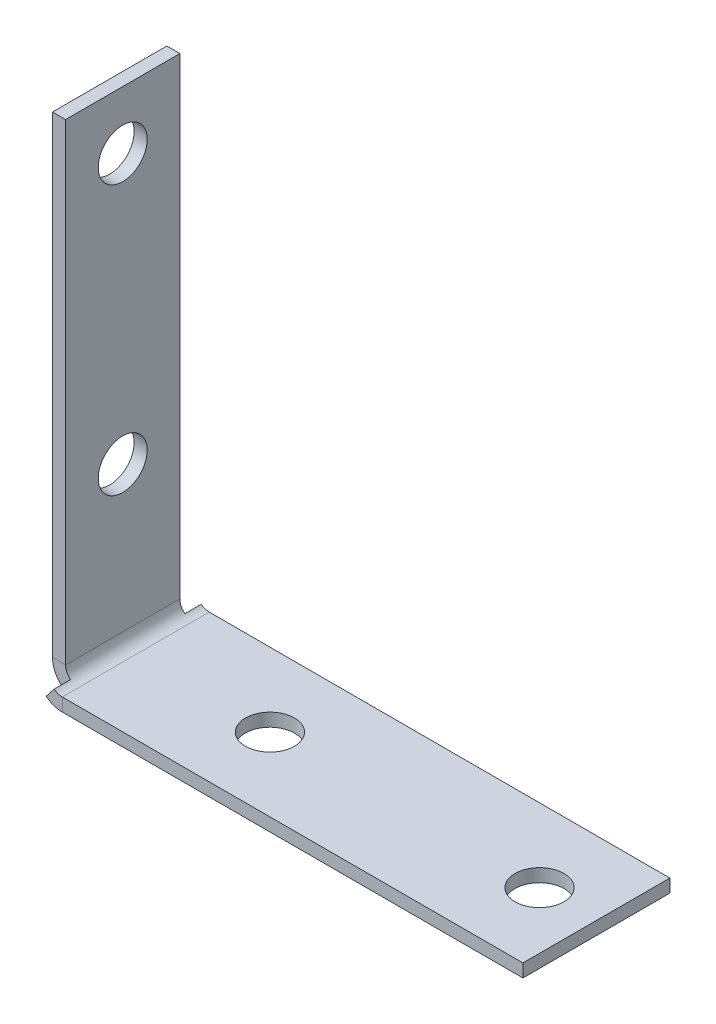
ISO-10303-21;
HEADER;
FILE_DESCRIPTION(('STEP AP214'),'2;1');
FILE_NAME('part.step','',(''),(''),'','','');
FILE_SCHEMA(('AUTOMOTIVE_DESIGN { 1 0 10303 214 1 1 1 1 }'));
ENDSEC;
DATA;
#1=APPLICATION_CONTEXT('core data for automotive mechanical design processes');
#2=APPLICATION_PROTOCOL_DEFINITION('international standard','automotive_design',2000,#1);
#3=PRODUCT_CONTEXT('',#1,'mechanical');
#4=PRODUCT('Part','Part','',(#3));
#5=PRODUCT_RELATED_PRODUCT_CATEGORY('part','',(#4));
#6=PRODUCT_DEFINITION_FORMATION('','',#4);
#7=PRODUCT_DEFINITION_CONTEXT('part definition',#1,'design');
#8=PRODUCT_DEFINITION('design','',#6,#7);
#9=PRODUCT_DEFINITION_SHAPE('','',#8);
#10=(LENGTH_UNIT() NAMED_UNIT(*) SI_UNIT(.MILLI.,.METRE.));
#11=(NAMED_UNIT(*) PLANE_ANGLE_UNIT() SI_UNIT($,.RADIAN.));
#12=(NAMED_UNIT(*) SI_UNIT($,.STERADIAN.) SOLID_ANGLE_UNIT());
#13=UNCERTAINTY_MEASURE_WITH_UNIT(LENGTH_MEASURE(1.E-05),#10,'distance_accuracy_value','');
#14=(GEOMETRIC_REPRESENTATION_CONTEXT(3) GLOBAL_UNCERTAINTY_ASSIGNED_CONTEXT((#13)) GLOBAL_UNIT_ASSIGNED_CONTEXT((#10,
#11,#12)) REPRESENTATION_CONTEXT('',''));
#15=CARTESIAN_POINT('',(0.,0.,0.));
#16=DIRECTION('',(0.,0.,1.));
#17=DIRECTION('',(1.,0.,0.));
#18=AXIS2_PLACEMENT_3D('',#15,#16,#17);
#19=CARTESIAN_POINT('',(-60.6697462830899,1.03008881569224,29.2051358956056));
#20=DIRECTION('',(0.,0.,1.));
#21=DIRECTION('',(0.,-1.,0.));
#22=AXIS2_PLACEMENT_3D('',#19,#20,#21);
#23=PLANE('',#22);
#24=DIRECTION('',(0.,-1.,0.));
#25=VECTOR('',#24,1.);
#26=CARTESIAN_POINT('',(-62.2697462830901,-59.6396574673976,29.2051358956056));
#27=LINE('',#26,#25);
#28=CARTESIAN_POINT('',(-62.2697462830896,61.0300888156922,29.2051358956056));
#29=VERTEX_POINT('',#28);
#30=CARTESIAN_POINT('',(-62.2697462830899,3.20000000000001,29.2051358956056));
#31=VERTEX_POINT('',#30);
#32=EDGE_CURVE('E175',#29,#31,#27,.T.);
#33=ORIENTED_EDGE('',*,*,#32,.T.);
#34=DIRECTION('',(1.,0.,0.));
#35=VECTOR('',#34,1.);
#36=CARTESIAN_POINT('',(-60.6697462830899,3.20000000000001,29.2051358956056));
#37=LINE('',#36,#35);
#38=CARTESIAN_POINT('',(-60.6697462830899,3.2,29.2051358956056));
#39=VERTEX_POINT('',#38);
#40=EDGE_CURVE('E157',#31,#39,#37,.T.);
#41=ORIENTED_EDGE('',*,*,#40,.T.);
#42=DIRECTION('',(0.,-1.,0.));
#43=VECTOR('',#42,1.);
#44=CARTESIAN_POINT('',(-60.6697462830899,1.03008881569224,29.2051358956056));
#45=LINE('',#44,#43);
#46=CARTESIAN_POINT('',(-60.6697462830896,61.0300888156922,29.2051358956056));
#47=VERTEX_POINT('',#46);
#48=EDGE_CURVE('E177',#47,#39,#45,.T.);
#49=ORIENTED_EDGE('',*,*,#48,.F.);
#50=DIRECTION('',(1.,0.,0.));
#51=VECTOR('',#50,1.);
#52=CARTESIAN_POINT('',(-60.6697462830896,61.0300888156922,29.2051358956056));
#53=LINE('',#52,#51);
#54=EDGE_CURVE('E70',#29,#47,#53,.T.);
#55=ORIENTED_EDGE('',*,*,#54,.F.);
#56=EDGE_LOOP('',(#33,#41,#49,#55));
#57=FACE_BOUND('',#56,.T.);
#58=ADVANCED_FACE('F44',(#57),#23,.T.);
#59=CARTESIAN_POINT('',(-60.6697462830899,1.03008881569224,15.2051358956056));
#60=DIRECTION('',(0.,0.,-1.));
#61=DIRECTION('',(0.,1.,0.));
#62=AXIS2_PLACEMENT_3D('',#59,#60,#61);
#63=PLANE('',#62);
#64=DIRECTION('',(0.,1.,0.));
#65=VECTOR('',#64,1.);
#66=CARTESIAN_POINT('',(-60.6697462830899,1.03008881569224,15.2051358956056));
#67=LINE('',#66,#65);
#68=CARTESIAN_POINT('',(-60.6697462830899,3.20000000000001,15.2051358956056));
#69=VERTEX_POINT('',#68);
#70=CARTESIAN_POINT('',(-60.6697462830896,61.0300888156922,15.2051358956056));
#71=VERTEX_POINT('',#70);
#72=EDGE_CURVE('E171',#69,#71,#67,.T.);
#73=ORIENTED_EDGE('',*,*,#72,.F.);
#74=DIRECTION('',(-1.,0.,0.));
#75=VECTOR('',#74,1.);
#76=CARTESIAN_POINT('',(-60.6697462830899,3.20000000000001,15.2051358956056));
#77=LINE('',#76,#75);
#78=CARTESIAN_POINT('',(-62.2697462830899,3.20000000000001,15.2051358956056));
#79=VERTEX_POINT('',#78);
#80=EDGE_CURVE('E12',#69,#79,#77,.T.);
#81=ORIENTED_EDGE('',*,*,#80,.T.);
#82=DIRECTION('',(0.,-1.,0.));
#83=VECTOR('',#82,1.);
#84=CARTESIAN_POINT('',(-62.2697462830901,-59.6396574673976,15.2051358956056));
#85=LINE('',#84,#83);
#86=CARTESIAN_POINT('',(-62.2697462830896,61.0300888156922,15.2051358956056));
#87=VERTEX_POINT('',#86);
#88=EDGE_CURVE('E83',#79,#87,#85,.F.);
#89=ORIENTED_EDGE('',*,*,#88,.T.);
#90=DIRECTION('',(1.,0.,0.));
#91=VECTOR('',#90,1.);
#92=CARTESIAN_POINT('',(-60.6697462830896,61.0300888156922,15.2051358956056));
#93=LINE('',#92,#91);
#94=EDGE_CURVE('E172',#87,#71,#93,.T.);
#95=ORIENTED_EDGE('',*,*,#94,.T.);
#96=EDGE_LOOP('',(#73,#81,#89,#95));
#97=FACE_BOUND('',#96,.T.);
#98=ADVANCED_FACE('F46',(#97),#63,.T.);
#99=CARTESIAN_POINT('',(-60.6697462830901,-59.6396574673976,0.));
#100=DIRECTION('',(1.,0.,0.));
#101=DIRECTION('',(0.,0.,1.));
#102=AXIS2_PLACEMENT_3D('',#99,#100,#101);
#103=PLANE('',#102);
#104=CARTESIAN_POINT('',(-60.6697462830897,53.9427274603514,22.2051358956056));
#105=DIRECTION('',(1.,0.,0.));
#106=DIRECTION('',(0.,0.,-1.));
#107=AXIS2_PLACEMENT_3D('',#104,#105,#106);
#108=CIRCLE('',#107,3.);
#109=CARTESIAN_POINT('',(-60.6697462830897,53.9427274603514,19.2051358956056));
#110=VERTEX_POINT('',#109);
#111=EDGE_CURVE('E594',#110,#110,#108,.T.);
#112=ORIENTED_EDGE('',*,*,#111,.F.);
#113=EDGE_LOOP('',(#112));
#114=FACE_BOUND('',#113,.T.);
#115=CARTESIAN_POINT('',(-60.6697462830898,20.9806033722713,22.2051358956056));
#116=DIRECTION('',(1.,0.,0.));
#117=DIRECTION('',(0.,0.,-1.));
#118=AXIS2_PLACEMENT_3D('',#115,#116,#117);
#119=CIRCLE('',#118,2.99999999999999);
#120=CARTESIAN_POINT('',(-60.6697462830898,20.9806033722713,19.2051358956056));
#121=VERTEX_POINT('',#120);
#122=EDGE_CURVE('E589',#121,#121,#119,.T.);
#123=ORIENTED_EDGE('',*,*,#122,.F.);
#124=EDGE_LOOP('',(#123));
#125=FACE_BOUND('',#124,.T.);
#126=ORIENTED_EDGE('',*,*,#48,.T.);
#127=DIRECTION('',(0.,0.,-1.));
#128=VECTOR('',#127,1.);
#129=CARTESIAN_POINT('',(-60.6697462830899,3.20000000000001,0.));
#130=LINE('',#129,#128);
#131=EDGE_CURVE('E185',#39,#69,#130,.T.);
#132=ORIENTED_EDGE('',*,*,#131,.T.);
#133=ORIENTED_EDGE('',*,*,#72,.T.);
#134=DIRECTION('',(0.,0.,1.));
#135=VECTOR('',#134,1.);
#136=CARTESIAN_POINT('',(-60.6697462830896,61.0300888156922,15.2051358956056));
#137=LINE('',#136,#135);
#138=EDGE_CURVE('E174',#71,#47,#137,.T.);
#139=ORIENTED_EDGE('',*,*,#138,.T.);
#140=EDGE_LOOP('',(#126,#132,#133,#139));
#141=FACE_BOUND('',#140,.T.);
#142=ADVANCED_FACE('F307',(#114,#125,#141),#103,.T.);
#143=CARTESIAN_POINT('',(-60.6697462830896,61.0300888156922,15.2051358956056));
#144=DIRECTION('',(0.,1.,0.));
#145=DIRECTION('',(0.,0.,1.));
#146=AXIS2_PLACEMENT_3D('',#143,#144,#145);
#147=PLANE('',#146);
#148=ORIENTED_EDGE('',*,*,#94,.F.);
#149=DIRECTION('',(0.,0.,1.));
#150=VECTOR('',#149,1.);
#151=CARTESIAN_POINT('',(-62.2697462830896,61.0300888156922,0.));
#152=LINE('',#151,#150);
#153=EDGE_CURVE('E167',#87,#29,#152,.T.);
#154=ORIENTED_EDGE('',*,*,#153,.T.);
#155=ORIENTED_EDGE('',*,*,#54,.T.);
#156=ORIENTED_EDGE('',*,*,#138,.F.);
#157=EDGE_LOOP('',(#148,#154,#155,#156));
#158=FACE_BOUND('',#157,.T.);
#159=ADVANCED_FACE('F299',(#158),#147,.T.);
#160=CARTESIAN_POINT('',(-62.2697462830901,-59.6396574673976,0.));
#161=DIRECTION('',(1.,0.,0.));
#162=DIRECTION('',(0.,0.,1.));
#163=AXIS2_PLACEMENT_3D('',#160,#161,#162);
#164=PLANE('',#163);
#165=CARTESIAN_POINT('',(-62.26974628309,20.9806033722713,22.2051358956056));
#166=DIRECTION('',(1.,0.,0.));
#167=DIRECTION('',(0.,0.,-1.));
#168=AXIS2_PLACEMENT_3D('',#165,#166,#167);
#169=CIRCLE('',#168,3.);
#170=CARTESIAN_POINT('',(-62.26974628309,20.9806033722713,19.2051358956056));
#171=VERTEX_POINT('',#170);
#172=EDGE_CURVE('E592',#171,#171,#169,.T.);
#173=ORIENTED_EDGE('',*,*,#172,.T.);
#174=EDGE_LOOP('',(#173));
#175=FACE_BOUND('',#174,.T.);
#176=CARTESIAN_POINT('',(-62.2697462830899,53.9427274603514,22.2051358956056));
#177=DIRECTION('',(1.,0.,0.));
#178=DIRECTION('',(0.,0.,-1.));
#179=AXIS2_PLACEMENT_3D('',#176,#177,#178);
#180=CIRCLE('',#179,3.);
#181=CARTESIAN_POINT('',(-62.2697462830899,53.9427274603514,19.2051358956056));
#182=VERTEX_POINT('',#181);
#183=EDGE_CURVE('E206',#182,#182,#180,.T.);
#184=ORIENTED_EDGE('',*,*,#183,.T.);
#185=EDGE_LOOP('',(#184));
#186=FACE_BOUND('',#185,.T.);
#187=DIRECTION('',(0.,0.,-1.));
#188=VECTOR('',#187,1.);
#189=CARTESIAN_POINT('',(-62.2697462830898,3.20000000000001,0.));
#190=LINE('',#189,#188);
#191=EDGE_CURVE('E53',#31,#79,#190,.T.);
#192=ORIENTED_EDGE('',*,*,#191,.F.);
#193=ORIENTED_EDGE('',*,*,#32,.F.);
#194=ORIENTED_EDGE('',*,*,#153,.F.);
#195=ORIENTED_EDGE('',*,*,#88,.F.);
#196=EDGE_LOOP('',(#192,#193,#194,#195));
#197=FACE_BOUND('',#196,.T.);
#198=ADVANCED_FACE('F166',(#175,#186,#197),#164,.F.);
#199=CARTESIAN_POINT('',(-2.66974628308985,1.6,31.2051358956056));
#200=DIRECTION('',(1.,0.,0.));
#201=DIRECTION('',(0.,0.,-1.));
#202=AXIS2_PLACEMENT_3D('',#199,#200,#201);
#203=PLANE('',#202);
#204=DIRECTION('',(0.,1.,0.));
#205=VECTOR('',#204,1.);
#206=CARTESIAN_POINT('',(-2.66974628308985,1.6,31.2051358956056));
#207=LINE('',#206,#205);
#208=CARTESIAN_POINT('',(-2.66974628308985,0.,31.2051358956056));
#209=VERTEX_POINT('',#208);
#210=CARTESIAN_POINT('',(-2.66974628308985,1.6,31.2051358956056));
#211=VERTEX_POINT('',#210);
#212=EDGE_CURVE('E240',#209,#211,#207,.T.);
#213=ORIENTED_EDGE('',*,*,#212,.F.);
#214=DIRECTION('',(0.,0.,1.));
#215=VECTOR('',#214,1.);
#216=CARTESIAN_POINT('',(-2.66974628308985,0.,0.));
#217=LINE('',#216,#215);
#218=CARTESIAN_POINT('',(-2.66974628308985,0.,13.2051358956056));
#219=VERTEX_POINT('',#218);
#220=EDGE_CURVE('E251',#209,#219,#217,.F.);
#221=ORIENTED_EDGE('',*,*,#220,.T.);
#222=DIRECTION('',(0.,1.,0.));
#223=VECTOR('',#222,1.);
#224=CARTESIAN_POINT('',(-2.66974628308985,1.6,13.2051358956056));
#225=LINE('',#224,#223);
#226=CARTESIAN_POINT('',(-2.66974628308985,1.6,13.2051358956056));
#227=VERTEX_POINT('',#226);
#228=EDGE_CURVE('E92',#219,#227,#225,.T.);
#229=ORIENTED_EDGE('',*,*,#228,.T.);
#230=DIRECTION('',(0.,0.,-1.));
#231=VECTOR('',#230,1.);
#232=CARTESIAN_POINT('',(-2.66974628308985,1.6,31.2051358956056));
#233=LINE('',#232,#231);
#234=EDGE_CURVE('E246',#211,#227,#233,.T.);
#235=ORIENTED_EDGE('',*,*,#234,.F.);
#236=EDGE_LOOP('',(#213,#221,#229,#235));
#237=FACE_BOUND('',#236,.T.);
#238=ADVANCED_FACE('F289',(#237),#203,.T.);
#239=CARTESIAN_POINT('',(0.,1.6,0.));
#240=DIRECTION('',(0.,1.,0.));
#241=DIRECTION('',(0.,0.,1.));
#242=AXIS2_PLACEMENT_3D('',#239,#240,#241);
#243=PLANE('',#242);
#244=CARTESIAN_POINT('',(-42.6296224772093,1.6,22.2186446613069));
#245=DIRECTION('',(0.,1.,0.));
#246=DIRECTION('',(0.,0.,1.));
#247=AXIS2_PLACEMENT_3D('',#244,#245,#246);
#248=CIRCLE('',#247,2.99999999999999);
#249=CARTESIAN_POINT('',(-42.6296224772093,1.6,25.2186446613069));
#250=VERTEX_POINT('',#249);
#251=EDGE_CURVE('E48',#250,#250,#248,.T.);
#252=ORIENTED_EDGE('',*,*,#251,.F.);
#253=EDGE_LOOP('',(#252));
#254=FACE_BOUND('',#253,.T.);
#255=CARTESIAN_POINT('',(-9.6329547902399,1.6,22.203419226682));
#256=DIRECTION('',(0.,1.,0.));
#257=DIRECTION('',(0.,0.,1.));
#258=AXIS2_PLACEMENT_3D('',#255,#256,#257);
#259=CIRCLE('',#258,2.99999999999999);
#260=CARTESIAN_POINT('',(-9.6329547902399,1.6,25.203419226682));
#261=VERTEX_POINT('',#260);
#262=EDGE_CURVE('E579',#261,#261,#259,.T.);
#263=ORIENTED_EDGE('',*,*,#262,.F.);
#264=EDGE_LOOP('',(#263));
#265=FACE_BOUND('',#264,.T.);
#266=DIRECTION('',(0.,0.,-1.));
#267=VECTOR('',#266,1.);
#268=CARTESIAN_POINT('',(-59.0697462830899,1.6,0.));
#269=LINE('',#268,#267);
#270=CARTESIAN_POINT('',(-59.0697462830899,1.6,31.2051358956056));
#271=VERTEX_POINT('',#270);
#272=CARTESIAN_POINT('',(-59.0697462830898,1.6,13.2051358956056));
#273=VERTEX_POINT('',#272);
#274=EDGE_CURVE('E234',#271,#273,#269,.T.);
#275=ORIENTED_EDGE('',*,*,#274,.F.);
#276=DIRECTION('',(1.,0.,0.));
#277=VECTOR('',#276,1.);
#278=CARTESIAN_POINT('',(-60.6697462830899,1.6,31.2051358956056));
#279=LINE('',#278,#277);
#280=EDGE_CURVE('E248',#271,#211,#279,.T.);
#281=ORIENTED_EDGE('',*,*,#280,.T.);
#282=ORIENTED_EDGE('',*,*,#234,.T.);
#283=DIRECTION('',(-1.,0.,0.));
#284=VECTOR('',#283,1.);
#285=CARTESIAN_POINT('',(-2.66974628308985,1.6,13.2051358956056));
#286=LINE('',#285,#284);
#287=EDGE_CURVE('E115',#227,#273,#286,.T.);
#288=ORIENTED_EDGE('',*,*,#287,.T.);
#289=EDGE_LOOP('',(#275,#281,#282,#288));
#290=FACE_BOUND('',#289,.T.);
#291=ADVANCED_FACE('F284',(#254,#265,#290),#243,.T.);
#292=CARTESIAN_POINT('',(-60.6697462830899,1.6,31.2051358956056));
#293=DIRECTION('',(0.,0.,1.));
#294=DIRECTION('',(1.,0.,0.));
#295=AXIS2_PLACEMENT_3D('',#292,#293,#294);
#296=PLANE('',#295);
#297=DIRECTION('',(0.,1.,0.));
#298=VECTOR('',#297,1.);
#299=CARTESIAN_POINT('',(-59.0697462830899,1.6,31.2051358956056));
#300=LINE('',#299,#298);
#301=CARTESIAN_POINT('',(-59.0697462830899,0.,31.2051358956056));
#302=VERTEX_POINT('',#301);
#303=EDGE_CURVE('E254',#302,#271,#300,.T.);
#304=ORIENTED_EDGE('',*,*,#303,.F.);
#305=DIRECTION('',(1.,0.,0.));
#306=VECTOR('',#305,1.);
#307=CARTESIAN_POINT('',(0.,0.,31.2051358956056));
#308=LINE('',#307,#306);
#309=EDGE_CURVE('E243',#302,#209,#308,.T.);
#310=ORIENTED_EDGE('',*,*,#309,.T.);
#311=ORIENTED_EDGE('',*,*,#212,.T.);
#312=ORIENTED_EDGE('',*,*,#280,.F.);
#313=EDGE_LOOP('',(#304,#310,#311,#312));
#314=FACE_BOUND('',#313,.T.);
#315=ADVANCED_FACE('F281',(#314),#296,.T.);
#316=CARTESIAN_POINT('',(0.,0.,0.));
#317=DIRECTION('',(0.,1.,0.));
#318=DIRECTION('',(0.,0.,1.));
#319=AXIS2_PLACEMENT_3D('',#316,#317,#318);
#320=PLANE('',#319);
#321=CARTESIAN_POINT('',(-9.6329547902399,0.,22.203419226682));
#322=DIRECTION('',(0.,-1.,0.));
#323=DIRECTION('',(0.,0.,-1.));
#324=AXIS2_PLACEMENT_3D('',#321,#322,#323);
#325=CIRCLE('',#324,2.99999999999999);
#326=CARTESIAN_POINT('',(-9.6329547902399,0.,19.203419226682));
#327=VERTEX_POINT('',#326);
#328=EDGE_CURVE('E582',#327,#327,#325,.T.);
#329=ORIENTED_EDGE('',*,*,#328,.F.);
#330=EDGE_LOOP('',(#329));
#331=FACE_BOUND('',#330,.T.);
#332=CARTESIAN_POINT('',(-42.6296224772093,0.,22.2186446613069));
#333=DIRECTION('',(0.,-1.,0.));
#334=DIRECTION('',(0.,0.,-1.));
#335=AXIS2_PLACEMENT_3D('',#332,#333,#334);
#336=CIRCLE('',#335,2.99999999999999);
#337=CARTESIAN_POINT('',(-42.6296224772093,0.,19.2186446613069));
#338=VERTEX_POINT('',#337);
#339=EDGE_CURVE('E584',#338,#338,#336,.T.);
#340=ORIENTED_EDGE('',*,*,#339,.F.);
#341=EDGE_LOOP('',(#340));
#342=FACE_BOUND('',#341,.T.);
#343=ORIENTED_EDGE('',*,*,#309,.F.);
#344=DIRECTION('',(0.,0.,-1.));
#345=VECTOR('',#344,1.);
#346=CARTESIAN_POINT('',(-59.0697462830899,0.,0.));
#347=LINE('',#346,#345);
#348=CARTESIAN_POINT('',(-59.0697462830899,0.,13.2051358956056));
#349=VERTEX_POINT('',#348);
#350=EDGE_CURVE('E237',#302,#349,#347,.T.);
#351=ORIENTED_EDGE('',*,*,#350,.T.);
#352=DIRECTION('',(1.,0.,0.));
#353=VECTOR('',#352,1.);
#354=CARTESIAN_POINT('',(0.,0.,13.2051358956056));
#355=LINE('',#354,#353);
#356=EDGE_CURVE('E168',#219,#349,#355,.F.);
#357=ORIENTED_EDGE('',*,*,#356,.F.);
#358=ORIENTED_EDGE('',*,*,#220,.F.);
#359=EDGE_LOOP('',(#343,#351,#357,#358));
#360=FACE_BOUND('',#359,.T.);
#361=ADVANCED_FACE('F288',(#331,#342,#360),#320,.F.);
#362=CARTESIAN_POINT('',(-2.66974628308985,1.6,13.2051358956056));
#363=DIRECTION('',(0.,0.,-1.));
#364=DIRECTION('',(-1.,0.,0.));
#365=AXIS2_PLACEMENT_3D('',#362,#363,#364);
#366=PLANE('',#365);
#367=DIRECTION('',(0.,-1.,0.));
#368=VECTOR('',#367,1.);
#369=CARTESIAN_POINT('',(-59.0697462830899,1.6,13.2051358956056));
#370=LINE('',#369,#368);
#371=EDGE_CURVE('E257',#273,#349,#370,.T.);
#372=ORIENTED_EDGE('',*,*,#371,.F.);
#373=ORIENTED_EDGE('',*,*,#287,.F.);
#374=ORIENTED_EDGE('',*,*,#228,.F.);
#375=ORIENTED_EDGE('',*,*,#356,.T.);
#376=EDGE_LOOP('',(#372,#373,#374,#375));
#377=FACE_BOUND('',#376,.T.);
#378=ADVANCED_FACE('F286',(#377),#366,.T.);
#379=CARTESIAN_POINT('',(-59.0697462830899,3.2,29.2051358956056));
#380=DIRECTION('',(0.,0.,-1.));
#381=DIRECTION('',(-1.,0.,0.));
#382=AXIS2_PLACEMENT_3D('',#379,#380,#381);
#383=PLANE('',#382);
#384=ORIENTED_EDGE('',*,*,#40,.F.);
#385=CARTESIAN_POINT('',(-59.0697462830899,3.2,29.2051358956056));
#386=DIRECTION('',(0.,0.,1.));
#387=DIRECTION('',(1.,0.,0.));
#388=AXIS2_PLACEMENT_3D('',#385,#386,#387);
#389=CIRCLE('',#388,3.2);
#390=CARTESIAN_POINT('',(-61.048529652913,0.685160765513765,29.2051358956056));
#391=VERTEX_POINT('',#390);
#392=EDGE_CURVE('E153',#31,#391,#389,.T.);
#393=ORIENTED_EDGE('',*,*,#392,.T.);
#394=DIRECTION('',(0.618369803069737,0.785887260776948,0.));
#395=VECTOR('',#394,1.);
#396=CARTESIAN_POINT('',(-60.0591379680014,1.94258038275688,29.2051358956056));
#397=LINE('',#396,#395);
#398=CARTESIAN_POINT('',(-60.0591379680014,1.94258038275688,29.2051358956056));
#399=VERTEX_POINT('',#398);
#400=EDGE_CURVE('E198',#391,#399,#397,.T.);
#401=ORIENTED_EDGE('',*,*,#400,.T.);
#402=CARTESIAN_POINT('',(-59.0697462830899,3.2,29.2051358956056));
#403=DIRECTION('',(0.,0.,1.));
#404=DIRECTION('',(1.,0.,0.));
#405=AXIS2_PLACEMENT_3D('',#402,#403,#404);
#406=CIRCLE('',#405,1.6);
#407=EDGE_CURVE('E162',#39,#399,#406,.T.);
#408=ORIENTED_EDGE('',*,*,#407,.F.);
#409=EDGE_LOOP('',(#384,#393,#401,#408));
#410=FACE_BOUND('',#409,.T.);
#411=ADVANCED_FACE('F195',(#410),#383,.F.);
#412=CARTESIAN_POINT('',(-60.0591379680014,1.94258038275688,30.2051358956056));
#413=DIRECTION('',(0.785887260776949,-0.618369803069736,0.));
#414=DIRECTION('',(0.,0.,1.));
#415=AXIS2_PLACEMENT_3D('',#412,#413,#414);
#416=PLANE('',#415);
#417=ORIENTED_EDGE('',*,*,#400,.F.);
#418=DIRECTION('',(0.,0.,1.));
#419=VECTOR('',#418,1.);
#420=CARTESIAN_POINT('',(-61.048529652913,0.685160765513765,3.74511882254828));
#421=LINE('',#420,#419);
#422=CARTESIAN_POINT('',(-61.048529652913,0.685160765513765,31.2051358956056));
#423=VERTEX_POINT('',#422);
#424=EDGE_CURVE('E224',#391,#423,#421,.T.);
#425=ORIENTED_EDGE('',*,*,#424,.T.);
#426=DIRECTION('',(0.618369803069736,0.785887260776949,0.));
#427=VECTOR('',#426,1.);
#428=CARTESIAN_POINT('',(-60.0591379680014,1.94258038275688,31.2051358956056));
#429=LINE('',#428,#427);
#430=CARTESIAN_POINT('',(-60.0591379680014,1.94258038275688,31.2051358956056));
#431=VERTEX_POINT('',#430);
#432=EDGE_CURVE('E230',#423,#431,#429,.T.);
#433=ORIENTED_EDGE('',*,*,#432,.T.);
#434=DIRECTION('',(0.,0.,1.));
#435=VECTOR('',#434,1.);
#436=CARTESIAN_POINT('',(-60.0591379680014,1.94258038275688,29.2051358956056));
#437=LINE('',#436,#435);
#438=EDGE_CURVE('E201',#399,#431,#437,.T.);
#439=ORIENTED_EDGE('',*,*,#438,.F.);
#440=EDGE_LOOP('',(#417,#425,#433,#439));
#441=FACE_BOUND('',#440,.T.);
#442=ADVANCED_FACE('F276',(#441),#416,.F.);
#443=CARTESIAN_POINT('',(-59.0697462830899,3.2,31.2051358956056));
#444=DIRECTION('',(0.,0.,-1.));
#445=DIRECTION('',(-1.,0.,0.));
#446=AXIS2_PLACEMENT_3D('',#443,#444,#445);
#447=PLANE('',#446);
#448=ORIENTED_EDGE('',*,*,#432,.F.);
#449=CARTESIAN_POINT('',(-59.0697462830899,3.2,31.2051358956056));
#450=DIRECTION('',(0.,0.,1.));
#451=DIRECTION('',(1.,0.,0.));
#452=AXIS2_PLACEMENT_3D('',#449,#450,#451);
#453=CIRCLE('',#452,3.2);
#454=EDGE_CURVE('E221',#423,#302,#453,.T.);
#455=ORIENTED_EDGE('',*,*,#454,.T.);
#456=ORIENTED_EDGE('',*,*,#303,.T.);
#457=CARTESIAN_POINT('',(-59.0697462830899,3.2,31.2051358956056));
#458=DIRECTION('',(0.,0.,1.));
#459=DIRECTION('',(1.,0.,0.));
#460=AXIS2_PLACEMENT_3D('',#457,#458,#459);
#461=CIRCLE('',#460,1.6);
#462=EDGE_CURVE('E203',#431,#271,#461,.T.);
#463=ORIENTED_EDGE('',*,*,#462,.F.);
#464=EDGE_LOOP('',(#448,#455,#456,#463));
#465=FACE_BOUND('',#464,.T.);
#466=ADVANCED_FACE('F272',(#465),#447,.F.);
#467=CARTESIAN_POINT('',(-59.0697462830899,3.2,13.2051358956056));
#468=DIRECTION('',(0.,0.,1.));
#469=DIRECTION('',(1.,0.,0.));
#470=AXIS2_PLACEMENT_3D('',#467,#468,#469);
#471=PLANE('',#470);
#472=ORIENTED_EDGE('',*,*,#371,.T.);
#473=CARTESIAN_POINT('',(-59.0697462830899,3.2,13.2051358956056));
#474=DIRECTION('',(0.,0.,1.));
#475=DIRECTION('',(1.,0.,0.));
#476=AXIS2_PLACEMENT_3D('',#473,#474,#475);
#477=CIRCLE('',#476,3.2);
#478=CARTESIAN_POINT('',(-61.048529652913,0.685160765513765,13.2051358956056));
#479=VERTEX_POINT('',#478);
#480=EDGE_CURVE('E218',#349,#479,#477,.F.);
#481=ORIENTED_EDGE('',*,*,#480,.T.);
#482=DIRECTION('',(0.618369803069736,0.785887260776949,0.));
#483=VECTOR('',#482,1.);
#484=CARTESIAN_POINT('',(-60.0591379680014,1.94258038275688,13.2051358956056));
#485=LINE('',#484,#483);
#486=CARTESIAN_POINT('',(-60.0591379680014,1.94258038275688,13.2051358956056));
#487=VERTEX_POINT('',#486);
#488=EDGE_CURVE('E228',#479,#487,#485,.T.);
#489=ORIENTED_EDGE('',*,*,#488,.T.);
#490=CARTESIAN_POINT('',(-59.0697462830899,3.2,13.2051358956056));
#491=DIRECTION('',(0.,0.,-1.));
#492=DIRECTION('',(-1.,0.,0.));
#493=AXIS2_PLACEMENT_3D('',#490,#491,#492);
#494=CIRCLE('',#493,1.6);
#495=EDGE_CURVE('E211',#273,#487,#494,.T.);
#496=ORIENTED_EDGE('',*,*,#495,.F.);
#497=EDGE_LOOP('',(#472,#481,#489,#496));
#498=FACE_BOUND('',#497,.T.);
#499=ADVANCED_FACE('F265',(#498),#471,.F.);
#500=CARTESIAN_POINT('',(-60.0591379680014,1.94258038275688,14.2051358956056));
#501=DIRECTION('',(0.785887260776949,-0.618369803069736,0.));
#502=DIRECTION('',(0.,0.,1.));
#503=AXIS2_PLACEMENT_3D('',#500,#501,#502);
#504=PLANE('',#503);
#505=ORIENTED_EDGE('',*,*,#488,.F.);
#506=DIRECTION('',(0.,0.,1.));
#507=VECTOR('',#506,1.);
#508=CARTESIAN_POINT('',(-61.048529652913,0.685160765513765,3.74511882254828));
#509=LINE('',#508,#507);
#510=CARTESIAN_POINT('',(-61.048529652913,0.685160765513765,15.2051358956056));
#511=VERTEX_POINT('',#510);
#512=EDGE_CURVE('E163',#479,#511,#509,.T.);
#513=ORIENTED_EDGE('',*,*,#512,.T.);
#514=DIRECTION('',(0.618369803069736,0.785887260776949,0.));
#515=VECTOR('',#514,1.);
#516=CARTESIAN_POINT('',(-60.0591379680014,1.94258038275688,15.2051358956056));
#517=LINE('',#516,#515);
#518=CARTESIAN_POINT('',(-60.0591379680014,1.94258038275688,15.2051358956056));
#519=VERTEX_POINT('',#518);
#520=EDGE_CURVE('E124',#511,#519,#517,.T.);
#521=ORIENTED_EDGE('',*,*,#520,.T.);
#522=DIRECTION('',(0.,0.,1.));
#523=VECTOR('',#522,1.);
#524=CARTESIAN_POINT('',(-60.0591379680014,1.94258038275688,13.2051358956056));
#525=LINE('',#524,#523);
#526=EDGE_CURVE('E214',#487,#519,#525,.T.);
#527=ORIENTED_EDGE('',*,*,#526,.F.);
#528=EDGE_LOOP('',(#505,#513,#521,#527));
#529=FACE_BOUND('',#528,.T.);
#530=ADVANCED_FACE('F267',(#529),#504,.F.);
#531=CARTESIAN_POINT('',(-59.0697462830899,3.2,15.2051358956056));
#532=DIRECTION('',(0.,0.,1.));
#533=DIRECTION('',(1.,0.,0.));
#534=AXIS2_PLACEMENT_3D('',#531,#532,#533);
#535=PLANE('',#534);
#536=CARTESIAN_POINT('',(-59.0697462830899,3.2,15.2051358956056));
#537=DIRECTION('',(0.,0.,1.));
#538=DIRECTION('',(1.,0.,0.));
#539=AXIS2_PLACEMENT_3D('',#536,#537,#538);
#540=CIRCLE('',#539,3.2);
#541=EDGE_CURVE('E150',#511,#79,#540,.F.);
#542=ORIENTED_EDGE('',*,*,#541,.T.);
#543=ORIENTED_EDGE('',*,*,#80,.F.);
#544=CARTESIAN_POINT('',(-59.0697462830899,3.2,15.2051358956056));
#545=DIRECTION('',(0.,0.,-1.));
#546=DIRECTION('',(-1.,0.,0.));
#547=AXIS2_PLACEMENT_3D('',#544,#545,#546);
#548=CIRCLE('',#547,1.6);
#549=EDGE_CURVE('E61',#519,#69,#548,.T.);
#550=ORIENTED_EDGE('',*,*,#549,.F.);
#551=ORIENTED_EDGE('',*,*,#520,.F.);
#552=EDGE_LOOP('',(#542,#543,#550,#551));
#553=FACE_BOUND('',#552,.T.);
#554=ADVANCED_FACE('F160',(#553),#535,.F.);
#555=CARTESIAN_POINT('',(-59.0697462830899,3.2,3.74511882254828));
#556=DIRECTION('',(0.,0.,1.));
#557=DIRECTION('',(1.,0.,0.));
#558=AXIS2_PLACEMENT_3D('',#555,#556,#557);
#559=CYLINDRICAL_SURFACE('',#558,1.6);
#560=ORIENTED_EDGE('',*,*,#526,.T.);
#561=ORIENTED_EDGE('',*,*,#549,.T.);
#562=ORIENTED_EDGE('',*,*,#131,.F.);
#563=ORIENTED_EDGE('',*,*,#407,.T.);
#564=ORIENTED_EDGE('',*,*,#438,.T.);
#565=ORIENTED_EDGE('',*,*,#462,.T.);
#566=ORIENTED_EDGE('',*,*,#274,.T.);
#567=ORIENTED_EDGE('',*,*,#495,.T.);
#568=EDGE_LOOP('',(#560,#561,#562,#563,#564,#565,#566,#567));
#569=FACE_BOUND('',#568,.T.);
#570=ADVANCED_FACE('F262',(#569),#559,.F.);
#571=CARTESIAN_POINT('',(-59.0697462830899,3.2,3.74511882254828));
#572=DIRECTION('',(0.,0.,1.));
#573=DIRECTION('',(1.,0.,0.));
#574=AXIS2_PLACEMENT_3D('',#571,#572,#573);
#575=CYLINDRICAL_SURFACE('',#574,3.2);
#576=ORIENTED_EDGE('',*,*,#512,.F.);
#577=ORIENTED_EDGE('',*,*,#480,.F.);
#578=ORIENTED_EDGE('',*,*,#350,.F.);
#579=ORIENTED_EDGE('',*,*,#454,.F.);
#580=ORIENTED_EDGE('',*,*,#424,.F.);
#581=ORIENTED_EDGE('',*,*,#392,.F.);
#582=ORIENTED_EDGE('',*,*,#191,.T.);
#583=ORIENTED_EDGE('',*,*,#541,.F.);
#584=EDGE_LOOP('',(#576,#577,#578,#579,#580,#581,#582,#583));
#585=FACE_BOUND('',#584,.T.);
#586=ADVANCED_FACE('F149',(#585),#575,.T.);
#587=CARTESIAN_POINT('',(-60.6697462830897,53.9427274603514,22.2051358956056));
#588=DIRECTION('',(1.,0.,0.));
#589=DIRECTION('',(0.,0.,-1.));
#590=AXIS2_PLACEMENT_3D('',#587,#588,#589);
#591=CYLINDRICAL_SURFACE('',#590,3.);
#592=ORIENTED_EDGE('',*,*,#183,.F.);
#593=EDGE_LOOP('',(#592));
#594=FACE_BOUND('',#593,.T.);
#595=ORIENTED_EDGE('',*,*,#111,.T.);
#596=EDGE_LOOP('',(#595));
#597=FACE_BOUND('',#596,.T.);
#598=ADVANCED_FACE('F381',(#594,#597),#591,.F.);
#599=CARTESIAN_POINT('',(-60.6697462830898,20.9806033722713,22.2051358956056));
#600=DIRECTION('',(1.,0.,0.));
#601=DIRECTION('',(0.,0.,-1.));
#602=AXIS2_PLACEMENT_3D('',#599,#600,#601);
#603=CYLINDRICAL_SURFACE('',#602,2.99999999999999);
#604=ORIENTED_EDGE('',*,*,#172,.F.);
#605=EDGE_LOOP('',(#604));
#606=FACE_BOUND('',#605,.T.);
#607=ORIENTED_EDGE('',*,*,#122,.T.);
#608=EDGE_LOOP('',(#607));
#609=FACE_BOUND('',#608,.T.);
#610=ADVANCED_FACE('F389',(#606,#609),#603,.F.);
#611=CARTESIAN_POINT('',(-42.6296224772093,0.,22.2186446613069));
#612=DIRECTION('',(0.,-1.,0.));
#613=DIRECTION('',(0.,0.,-1.));
#614=AXIS2_PLACEMENT_3D('',#611,#612,#613);
#615=CYLINDRICAL_SURFACE('',#614,2.99999999999999);
#616=ORIENTED_EDGE('',*,*,#251,.T.);
#617=EDGE_LOOP('',(#616));
#618=FACE_BOUND('',#617,.T.);
#619=ORIENTED_EDGE('',*,*,#339,.T.);
#620=EDGE_LOOP('',(#619));
#621=FACE_BOUND('',#620,.T.);
#622=ADVANCED_FACE('F400',(#618,#621),#615,.F.);
#623=CARTESIAN_POINT('',(-9.6329547902399,0.,22.203419226682));
#624=DIRECTION('',(0.,-1.,0.));
#625=DIRECTION('',(0.,0.,-1.));
#626=AXIS2_PLACEMENT_3D('',#623,#624,#625);
#627=CYLINDRICAL_SURFACE('',#626,2.99999999999999);
#628=ORIENTED_EDGE('',*,*,#262,.T.);
#629=EDGE_LOOP('',(#628));
#630=FACE_BOUND('',#629,.T.);
#631=ORIENTED_EDGE('',*,*,#328,.T.);
#632=EDGE_LOOP('',(#631));
#633=FACE_BOUND('',#632,.T.);
#634=ADVANCED_FACE('F411',(#630,#633),#627,.F.);
#635=CLOSED_SHELL('',(#58,#98,#142,#159,#198,#238,#291,#315,#361,#378,#411,#442,#466,#499,#530,
#554,#570,#586,#598,#610,#622,#634));
#636=MANIFOLD_SOLID_BREP('B2',#635);
#637=ADVANCED_BREP_SHAPE_REPRESENTATION('',(#18,#636),#14);
#638=SHAPE_DEFINITION_REPRESENTATION(#9,#637);
ENDSEC;
END-ISO-10303-21;
